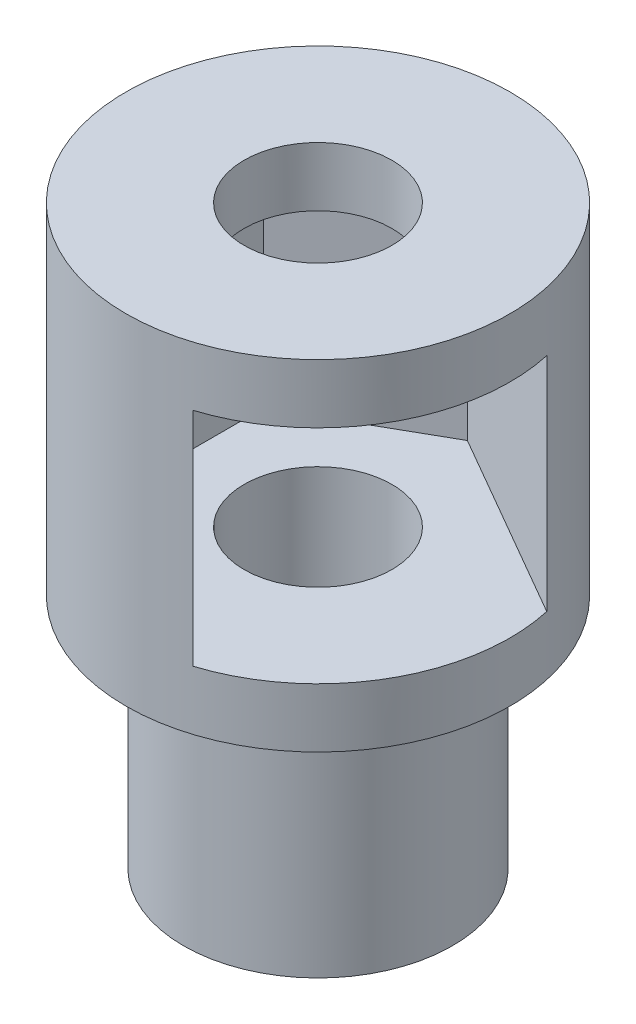
ISO-10303-21;
HEADER;
FILE_DESCRIPTION(('STEP AP214'),'2;1');
FILE_NAME('part.step','',(''),(''),'','','');
FILE_SCHEMA(('AUTOMOTIVE_DESIGN { 1 0 10303 214 1 1 1 1 }'));
ENDSEC;
DATA;
#1=APPLICATION_CONTEXT('core data for automotive mechanical design processes');
#2=APPLICATION_PROTOCOL_DEFINITION('international standard','automotive_design',2000,#1);
#3=PRODUCT_CONTEXT('',#1,'mechanical');
#4=PRODUCT('Part','Part','',(#3));
#5=PRODUCT_RELATED_PRODUCT_CATEGORY('part','',(#4));
#6=PRODUCT_DEFINITION_FORMATION('','',#4);
#7=PRODUCT_DEFINITION_CONTEXT('part definition',#1,'design');
#8=PRODUCT_DEFINITION('design','',#6,#7);
#9=PRODUCT_DEFINITION_SHAPE('','',#8);
#10=(LENGTH_UNIT() NAMED_UNIT(*) SI_UNIT(.MILLI.,.METRE.));
#11=(NAMED_UNIT(*) PLANE_ANGLE_UNIT() SI_UNIT($,.RADIAN.));
#12=(NAMED_UNIT(*) SI_UNIT($,.STERADIAN.) SOLID_ANGLE_UNIT());
#13=UNCERTAINTY_MEASURE_WITH_UNIT(LENGTH_MEASURE(1.E-05),#10,'distance_accuracy_value','');
#14=(GEOMETRIC_REPRESENTATION_CONTEXT(3) GLOBAL_UNCERTAINTY_ASSIGNED_CONTEXT((#13)) GLOBAL_UNIT_ASSIGNED_CONTEXT((#10,
#11,#12)) REPRESENTATION_CONTEXT('',''));
#15=CARTESIAN_POINT('',(0.,0.,0.));
#16=DIRECTION('',(0.,0.,1.));
#17=DIRECTION('',(1.,0.,0.));
#18=AXIS2_PLACEMENT_3D('',#15,#16,#17);
#19=CARTESIAN_POINT('',(0.,8.,0.));
#20=DIRECTION('',(0.,-1.,0.));
#21=DIRECTION('',(0.,0.,-1.));
#22=AXIS2_PLACEMENT_3D('',#19,#20,#21);
#23=CYLINDRICAL_SURFACE('',#22,4.55);
#24=CARTESIAN_POINT('',(0.,8.,0.));
#25=DIRECTION('',(0.,1.,0.));
#26=DIRECTION('',(0.,0.,1.));
#27=AXIS2_PLACEMENT_3D('',#24,#25,#26);
#28=CIRCLE('',#27,4.55);
#29=CARTESIAN_POINT('',(0.,8.,4.55));
#30=VERTEX_POINT('',#29);
#31=EDGE_CURVE('E110',#30,#30,#28,.T.);
#32=ORIENTED_EDGE('',*,*,#31,.F.);
#33=EDGE_LOOP('',(#32));
#34=FACE_BOUND('',#33,.T.);
#35=CARTESIAN_POINT('',(0.,0.,0.));
#36=DIRECTION('',(0.,1.,0.));
#37=DIRECTION('',(0.,0.,1.));
#38=AXIS2_PLACEMENT_3D('',#35,#36,#37);
#39=CIRCLE('',#38,4.55);
#40=CARTESIAN_POINT('',(0.,0.,4.55));
#41=VERTEX_POINT('',#40);
#42=EDGE_CURVE('E113',#41,#41,#39,.T.);
#43=ORIENTED_EDGE('',*,*,#42,.T.);
#44=EDGE_LOOP('',(#43));
#45=FACE_BOUND('',#44,.T.);
#46=ADVANCED_FACE('F39',(#34,#45),#23,.T.);
#47=CARTESIAN_POINT('',(0.,0.,0.));
#48=DIRECTION('',(0.,1.,0.));
#49=DIRECTION('',(0.,0.,1.));
#50=AXIS2_PLACEMENT_3D('',#47,#48,#49);
#51=PLANE('',#50);
#52=CARTESIAN_POINT('',(0.,0.,0.));
#53=DIRECTION('',(0.,1.,0.));
#54=DIRECTION('',(0.,0.,1.));
#55=AXIS2_PLACEMENT_3D('',#52,#53,#54);
#56=CIRCLE('',#55,2.5);
#57=CARTESIAN_POINT('',(0.,0.,2.5));
#58=VERTEX_POINT('',#57);
#59=EDGE_CURVE('E117',#58,#58,#56,.T.);
#60=ORIENTED_EDGE('',*,*,#59,.T.);
#61=EDGE_LOOP('',(#60));
#62=FACE_BOUND('',#61,.T.);
#63=ORIENTED_EDGE('',*,*,#42,.F.);
#64=EDGE_LOOP('',(#63));
#65=FACE_BOUND('',#64,.T.);
#66=ADVANCED_FACE('F187',(#62,#65),#51,.F.);
#67=CARTESIAN_POINT('',(0.,0.,0.));
#68=DIRECTION('',(0.,1.,0.));
#69=DIRECTION('',(0.,0.,1.));
#70=AXIS2_PLACEMENT_3D('',#67,#68,#69);
#71=CYLINDRICAL_SURFACE('',#70,2.5);
#72=ORIENTED_EDGE('',*,*,#59,.F.);
#73=EDGE_LOOP('',(#72));
#74=FACE_BOUND('',#73,.T.);
#75=CARTESIAN_POINT('',(0.,10.,0.));
#76=DIRECTION('',(0.,1.,0.));
#77=DIRECTION('',(0.,0.,1.));
#78=AXIS2_PLACEMENT_3D('',#75,#76,#77);
#79=CIRCLE('',#78,2.5);
#80=CARTESIAN_POINT('',(0.,10.,2.5));
#81=VERTEX_POINT('',#80);
#82=EDGE_CURVE('E95',#81,#81,#79,.T.);
#83=ORIENTED_EDGE('',*,*,#82,.T.);
#84=EDGE_LOOP('',(#83));
#85=FACE_BOUND('',#84,.T.);
#86=ADVANCED_FACE('F192',(#74,#85),#71,.F.);
#87=CARTESIAN_POINT('',(0.,8.,0.));
#88=DIRECTION('',(0.,1.,0.));
#89=DIRECTION('',(0.,0.,1.));
#90=AXIS2_PLACEMENT_3D('',#87,#88,#89);
#91=PLANE('',#90);
#92=ORIENTED_EDGE('',*,*,#31,.T.);
#93=EDGE_LOOP('',(#92));
#94=FACE_BOUND('',#93,.T.);
#95=CARTESIAN_POINT('',(0.,8.,0.));
#96=DIRECTION('',(0.,1.,0.));
#97=DIRECTION('',(0.,0.,1.));
#98=AXIS2_PLACEMENT_3D('',#95,#96,#97);
#99=CIRCLE('',#98,6.5);
#100=CARTESIAN_POINT('',(0.,8.,6.5));
#101=VERTEX_POINT('',#100);
#102=EDGE_CURVE('E124',#101,#101,#99,.T.);
#103=ORIENTED_EDGE('',*,*,#102,.F.);
#104=EDGE_LOOP('',(#103));
#105=FACE_BOUND('',#104,.T.);
#106=ADVANCED_FACE('F199',(#94,#105),#91,.F.);
#107=CARTESIAN_POINT('',(0.,17.5,0.));
#108=DIRECTION('',(0.,-1.,0.));
#109=DIRECTION('',(0.,0.,-1.));
#110=AXIS2_PLACEMENT_3D('',#107,#108,#109);
#111=CYLINDRICAL_SURFACE('',#110,6.5);
#112=DIRECTION('',(0.,-1.,0.));
#113=VECTOR('',#112,1.);
#114=CARTESIAN_POINT('',(1.96104571383836,17.5,6.19712027543731));
#115=LINE('',#114,#113);
#116=CARTESIAN_POINT('',(1.96104571383836,10.,6.19712027543731));
#117=VERTEX_POINT('',#116);
#118=CARTESIAN_POINT('',(1.96104571383836,17.5,6.19712027543731));
#119=VERTEX_POINT('',#118);
#120=EDGE_CURVE('E48',#117,#119,#115,.F.);
#121=ORIENTED_EDGE('',*,*,#120,.T.);
#122=CARTESIAN_POINT('',(0.,17.5,0.));
#123=DIRECTION('',(0.,1.,0.));
#124=DIRECTION('',(0.,0.,1.));
#125=AXIS2_PLACEMENT_3D('',#122,#123,#124);
#126=CIRCLE('',#125,6.5);
#127=CARTESIAN_POINT('',(6.34917641869559,17.5,-1.39210588831449));
#128=VERTEX_POINT('',#127);
#129=EDGE_CURVE('E85',#119,#128,#126,.T.);
#130=ORIENTED_EDGE('',*,*,#129,.T.);
#131=DIRECTION('',(0.,-1.,0.));
#132=VECTOR('',#131,1.);
#133=CARTESIAN_POINT('',(6.34917641869559,17.5,-1.39210588831449));
#134=LINE('',#133,#132);
#135=CARTESIAN_POINT('',(6.34917641869559,10.,-1.39210588831449));
#136=VERTEX_POINT('',#135);
#137=EDGE_CURVE('E11',#128,#136,#134,.T.);
#138=ORIENTED_EDGE('',*,*,#137,.T.);
#139=CARTESIAN_POINT('',(0.,10.,0.));
#140=DIRECTION('',(0.,1.,0.));
#141=DIRECTION('',(0.,0.,1.));
#142=AXIS2_PLACEMENT_3D('',#139,#140,#141);
#143=CIRCLE('',#142,6.5);
#144=EDGE_CURVE('E54',#117,#136,#143,.T.);
#145=ORIENTED_EDGE('',*,*,#144,.F.);
#146=EDGE_LOOP('',(#121,#130,#138,#145));
#147=FACE_BOUND('',#146,.T.);
#148=ORIENTED_EDGE('',*,*,#102,.T.);
#149=EDGE_LOOP('',(#148));
#150=FACE_BOUND('',#149,.T.);
#151=CARTESIAN_POINT('',(0.,19.5,0.));
#152=DIRECTION('',(0.,1.,0.));
#153=DIRECTION('',(0.,0.,1.));
#154=AXIS2_PLACEMENT_3D('',#151,#152,#153);
#155=CIRCLE('',#154,6.5);
#156=CARTESIAN_POINT('',(0.,19.5,6.5));
#157=VERTEX_POINT('',#156);
#158=EDGE_CURVE('E94',#157,#157,#155,.T.);
#159=ORIENTED_EDGE('',*,*,#158,.F.);
#160=EDGE_LOOP('',(#159));
#161=FACE_BOUND('',#160,.T.);
#162=ADVANCED_FACE('F105',(#147,#150,#161),#111,.T.);
#163=CARTESIAN_POINT('',(-0.00615345853108425,10.,-5.06135730372019));
#164=DIRECTION('',(0.5,0.,-0.866025403784438));
#165=DIRECTION('',(-0.866025403784438,0.,-0.500000000000001));
#166=AXIS2_PLACEMENT_3D('',#163,#164,#165);
#167=PLANE('',#166);
#168=DIRECTION('',(-0.866025403784438,0.,-0.5));
#169=VECTOR('',#168,1.);
#170=CARTESIAN_POINT('',(-0.00615345853108425,17.5,-5.06135730372019));
#171=LINE('',#170,#169);
#172=CARTESIAN_POINT('',(-0.00615345853108425,17.5,-5.06135730372019));
#173=VERTEX_POINT('',#172);
#174=EDGE_CURVE('E91',#128,#173,#171,.T.);
#175=ORIENTED_EDGE('',*,*,#174,.T.);
#176=DIRECTION('',(0.,1.,0.));
#177=VECTOR('',#176,1.);
#178=CARTESIAN_POINT('',(-0.00615345853108425,10.,-5.06135730372019));
#179=LINE('',#178,#177);
#180=CARTESIAN_POINT('',(-0.00615345853108425,10.,-5.06135730372019));
#181=VERTEX_POINT('',#180);
#182=EDGE_CURVE('E128',#181,#173,#179,.T.);
#183=ORIENTED_EDGE('',*,*,#182,.F.);
#184=DIRECTION('',(-0.866025403784438,0.,-0.5));
#185=VECTOR('',#184,1.);
#186=CARTESIAN_POINT('',(-0.00615345853108425,10.,-5.06135730372019));
#187=LINE('',#186,#185);
#188=EDGE_CURVE('E133',#136,#181,#187,.T.);
#189=ORIENTED_EDGE('',*,*,#188,.F.);
#190=ORIENTED_EDGE('',*,*,#137,.F.);
#191=EDGE_LOOP('',(#175,#183,#189,#190));
#192=FACE_BOUND('',#191,.T.);
#193=ADVANCED_FACE('F206',(#192),#167,.F.);
#194=CARTESIAN_POINT('',(3.43599475864028,10.,7.04868250349468));
#195=DIRECTION('',(-0.5,0.,0.866025403784439));
#196=DIRECTION('',(0.866025403784439,0.,0.5));
#197=AXIS2_PLACEMENT_3D('',#194,#195,#196);
#198=PLANE('',#197);
#199=DIRECTION('',(0.866025403784439,0.,0.5));
#200=VECTOR('',#199,1.);
#201=CARTESIAN_POINT('',(3.43599475864028,10.,7.04868250349468));
#202=LINE('',#201,#200);
#203=CARTESIAN_POINT('',(-4.40615345853113,10.,2.52101611928582));
#204=VERTEX_POINT('',#203);
#205=EDGE_CURVE('E150',#204,#117,#202,.T.);
#206=ORIENTED_EDGE('',*,*,#205,.F.);
#207=DIRECTION('',(0.,1.,0.));
#208=VECTOR('',#207,1.);
#209=CARTESIAN_POINT('',(-4.40615345853113,10.,2.52101611928582));
#210=LINE('',#209,#208);
#211=CARTESIAN_POINT('',(-4.40615345853113,17.5,2.52101611928582));
#212=VERTEX_POINT('',#211);
#213=EDGE_CURVE('E100',#204,#212,#210,.T.);
#214=ORIENTED_EDGE('',*,*,#213,.T.);
#215=DIRECTION('',(0.866025403784439,0.,0.5));
#216=VECTOR('',#215,1.);
#217=CARTESIAN_POINT('',(3.43599475864028,17.5,7.04868250349468));
#218=LINE('',#217,#216);
#219=EDGE_CURVE('E88',#212,#119,#218,.T.);
#220=ORIENTED_EDGE('',*,*,#219,.T.);
#221=ORIENTED_EDGE('',*,*,#120,.F.);
#222=EDGE_LOOP('',(#206,#214,#220,#221));
#223=FACE_BOUND('',#222,.T.);
#224=ADVANCED_FACE('F99',(#223),#198,.F.);
#225=CARTESIAN_POINT('',(0.,10.,0.));
#226=DIRECTION('',(0.,1.,0.));
#227=DIRECTION('',(0.,0.,1.));
#228=AXIS2_PLACEMENT_3D('',#225,#226,#227);
#229=PLANE('',#228);
#230=ORIENTED_EDGE('',*,*,#82,.F.);
#231=EDGE_LOOP('',(#230));
#232=FACE_BOUND('',#231,.T.);
#233=ORIENTED_EDGE('',*,*,#205,.T.);
#234=ORIENTED_EDGE('',*,*,#144,.T.);
#235=ORIENTED_EDGE('',*,*,#188,.T.);
#236=DIRECTION('',(-0.869313016670054,0.,0.494261953874673));
#237=VECTOR('',#236,1.);
#238=CARTESIAN_POINT('',(-4.40615345853113,10.,-2.55966624958288));
#239=LINE('',#238,#237);
#240=CARTESIAN_POINT('',(-4.40615345853113,10.,-2.55966624958288));
#241=VERTEX_POINT('',#240);
#242=EDGE_CURVE('E140',#181,#241,#239,.T.);
#243=ORIENTED_EDGE('',*,*,#242,.T.);
#244=DIRECTION('',(0.,0.,1.));
#245=VECTOR('',#244,1.);
#246=CARTESIAN_POINT('',(-4.40615345853113,10.,2.52101611928582));
#247=LINE('',#246,#245);
#248=EDGE_CURVE('E153',#241,#204,#247,.T.);
#249=ORIENTED_EDGE('',*,*,#248,.T.);
#250=EDGE_LOOP('',(#233,#234,#235,#243,#249));
#251=FACE_BOUND('',#250,.T.);
#252=ADVANCED_FACE('F219',(#232,#251),#229,.T.);
#253=CARTESIAN_POINT('',(-4.40615345853113,10.,-2.55966624958288));
#254=DIRECTION('',(-0.494261953874673,0.,-0.869313016670054));
#255=DIRECTION('',(-0.869313016670054,0.,0.494261953874674));
#256=AXIS2_PLACEMENT_3D('',#253,#254,#255);
#257=PLANE('',#256);
#258=DIRECTION('',(-0.869313016670054,0.,0.494261953874673));
#259=VECTOR('',#258,1.);
#260=CARTESIAN_POINT('',(-4.40615345853113,17.5,-2.55966624958288));
#261=LINE('',#260,#259);
#262=CARTESIAN_POINT('',(-4.40615345853113,17.5,-2.55966624958288));
#263=VERTEX_POINT('',#262);
#264=EDGE_CURVE('E144',#173,#263,#261,.T.);
#265=ORIENTED_EDGE('',*,*,#264,.T.);
#266=DIRECTION('',(0.,1.,0.));
#267=VECTOR('',#266,1.);
#268=CARTESIAN_POINT('',(-4.40615345853113,10.,-2.55966624958288));
#269=LINE('',#268,#267);
#270=EDGE_CURVE('E129',#241,#263,#269,.T.);
#271=ORIENTED_EDGE('',*,*,#270,.F.);
#272=ORIENTED_EDGE('',*,*,#242,.F.);
#273=ORIENTED_EDGE('',*,*,#182,.T.);
#274=EDGE_LOOP('',(#265,#271,#272,#273));
#275=FACE_BOUND('',#274,.T.);
#276=ADVANCED_FACE('F215',(#275),#257,.F.);
#277=CARTESIAN_POINT('',(-4.40615345853113,10.,2.52101611928582));
#278=DIRECTION('',(-1.,0.,0.));
#279=DIRECTION('',(0.,0.,1.));
#280=AXIS2_PLACEMENT_3D('',#277,#278,#279);
#281=PLANE('',#280);
#282=DIRECTION('',(0.,0.,1.));
#283=VECTOR('',#282,1.);
#284=CARTESIAN_POINT('',(-4.40615345853113,17.5,2.52101611928582));
#285=LINE('',#284,#283);
#286=EDGE_CURVE('E103',#263,#212,#285,.T.);
#287=ORIENTED_EDGE('',*,*,#286,.T.);
#288=ORIENTED_EDGE('',*,*,#213,.F.);
#289=ORIENTED_EDGE('',*,*,#248,.F.);
#290=ORIENTED_EDGE('',*,*,#270,.T.);
#291=EDGE_LOOP('',(#287,#288,#289,#290));
#292=FACE_BOUND('',#291,.T.);
#293=ADVANCED_FACE('F211',(#292),#281,.F.);
#294=CARTESIAN_POINT('',(0.,19.5,0.));
#295=DIRECTION('',(0.,1.,0.));
#296=DIRECTION('',(0.,0.,1.));
#297=AXIS2_PLACEMENT_3D('',#294,#295,#296);
#298=PLANE('',#297);
#299=CARTESIAN_POINT('',(0.,19.5,0.));
#300=DIRECTION('',(0.,-1.,0.));
#301=DIRECTION('',(0.,0.,-1.));
#302=AXIS2_PLACEMENT_3D('',#299,#300,#301);
#303=CIRCLE('',#302,2.5);
#304=CARTESIAN_POINT('',(0.,19.5,-2.5));
#305=VERTEX_POINT('',#304);
#306=EDGE_CURVE('E166',#305,#305,#303,.T.);
#307=ORIENTED_EDGE('',*,*,#306,.T.);
#308=EDGE_LOOP('',(#307));
#309=FACE_BOUND('',#308,.T.);
#310=ORIENTED_EDGE('',*,*,#158,.T.);
#311=EDGE_LOOP('',(#310));
#312=FACE_BOUND('',#311,.T.);
#313=ADVANCED_FACE('F183',(#309,#312),#298,.T.);
#314=CARTESIAN_POINT('',(0.,17.5,0.));
#315=DIRECTION('',(0.,1.,0.));
#316=DIRECTION('',(0.,0.,1.));
#317=AXIS2_PLACEMENT_3D('',#314,#315,#316);
#318=PLANE('',#317);
#319=CARTESIAN_POINT('',(0.,17.5,0.));
#320=DIRECTION('',(0.,1.,0.));
#321=DIRECTION('',(0.,0.,1.));
#322=AXIS2_PLACEMENT_3D('',#319,#320,#321);
#323=CIRCLE('',#322,2.5);
#324=CARTESIAN_POINT('',(0.,17.5,2.5));
#325=VERTEX_POINT('',#324);
#326=EDGE_CURVE('E42',#325,#325,#323,.T.);
#327=ORIENTED_EDGE('',*,*,#326,.T.);
#328=EDGE_LOOP('',(#327));
#329=FACE_BOUND('',#328,.T.);
#330=ORIENTED_EDGE('',*,*,#174,.F.);
#331=ORIENTED_EDGE('',*,*,#129,.F.);
#332=ORIENTED_EDGE('',*,*,#219,.F.);
#333=ORIENTED_EDGE('',*,*,#286,.F.);
#334=ORIENTED_EDGE('',*,*,#264,.F.);
#335=EDGE_LOOP('',(#330,#331,#332,#333,#334));
#336=FACE_BOUND('',#335,.T.);
#337=ADVANCED_FACE('F87',(#329,#336),#318,.F.);
#338=CARTESIAN_POINT('',(0.,19.5,0.));
#339=DIRECTION('',(0.,-1.,0.));
#340=DIRECTION('',(0.,0.,-1.));
#341=AXIS2_PLACEMENT_3D('',#338,#339,#340);
#342=CYLINDRICAL_SURFACE('',#341,2.5);
#343=ORIENTED_EDGE('',*,*,#306,.F.);
#344=EDGE_LOOP('',(#343));
#345=FACE_BOUND('',#344,.T.);
#346=ORIENTED_EDGE('',*,*,#326,.F.);
#347=EDGE_LOOP('',(#346));
#348=FACE_BOUND('',#347,.T.);
#349=ADVANCED_FACE('F176',(#345,#348),#342,.F.);
#350=CLOSED_SHELL('',(#46,#66,#86,#106,#162,#193,#224,#252,#276,#293,#313,#337,#349));
#351=MANIFOLD_SOLID_BREP('B2',#350);
#352=ADVANCED_BREP_SHAPE_REPRESENTATION('',(#18,#351),#14);
#353=SHAPE_DEFINITION_REPRESENTATION(#9,#352);
ENDSEC;
END-ISO-10303-21;
